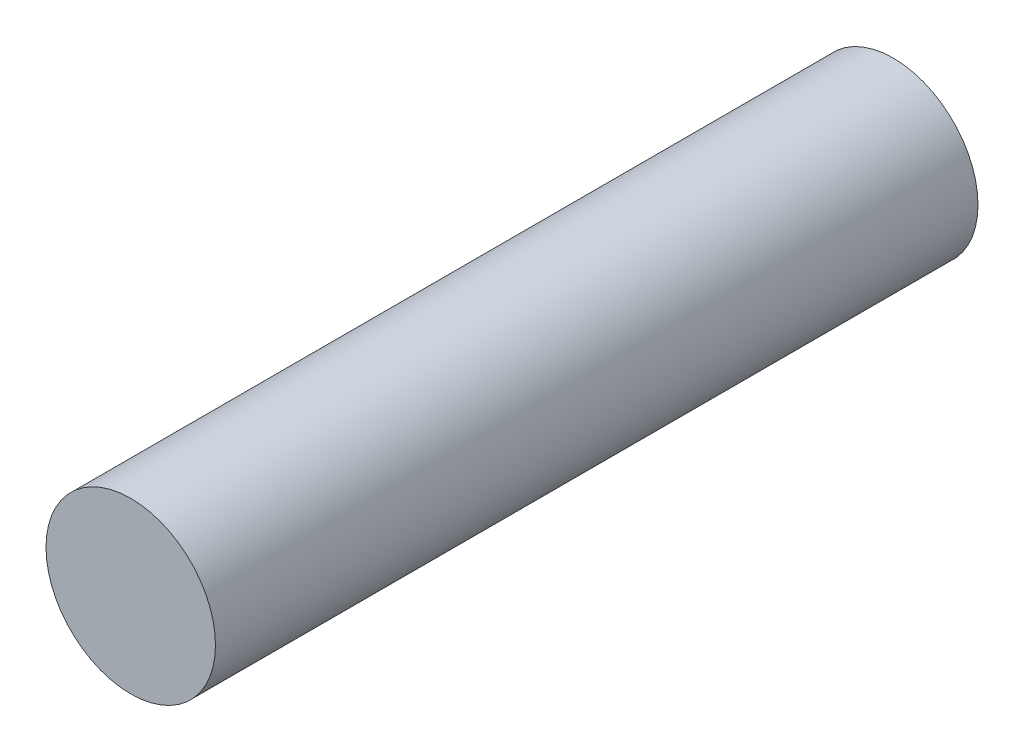
ISO-10303-21;
HEADER;
FILE_DESCRIPTION(('STEP AP214'),'2;1');
FILE_NAME('part.step','',(''),(''),'','','');
FILE_SCHEMA(('AUTOMOTIVE_DESIGN { 1 0 10303 214 1 1 1 1 }'));
ENDSEC;
DATA;
#1=APPLICATION_CONTEXT('core data for automotive mechanical design processes');
#2=APPLICATION_PROTOCOL_DEFINITION('international standard','automotive_design',2000,#1);
#3=PRODUCT_CONTEXT('',#1,'mechanical');
#4=PRODUCT('Part','Part','',(#3));
#5=PRODUCT_RELATED_PRODUCT_CATEGORY('part','',(#4));
#6=PRODUCT_DEFINITION_FORMATION('','',#4);
#7=PRODUCT_DEFINITION_CONTEXT('part definition',#1,'design');
#8=PRODUCT_DEFINITION('design','',#6,#7);
#9=PRODUCT_DEFINITION_SHAPE('','',#8);
#10=(LENGTH_UNIT() NAMED_UNIT(*) SI_UNIT(.MILLI.,.METRE.));
#11=(NAMED_UNIT(*) PLANE_ANGLE_UNIT() SI_UNIT($,.RADIAN.));
#12=(NAMED_UNIT(*) SI_UNIT($,.STERADIAN.) SOLID_ANGLE_UNIT());
#13=UNCERTAINTY_MEASURE_WITH_UNIT(LENGTH_MEASURE(1.E-05),#10,'distance_accuracy_value','');
#14=(GEOMETRIC_REPRESENTATION_CONTEXT(3) GLOBAL_UNCERTAINTY_ASSIGNED_CONTEXT((#13)) GLOBAL_UNIT_ASSIGNED_CONTEXT((#10,
#11,#12)) REPRESENTATION_CONTEXT('',''));
#15=CARTESIAN_POINT('',(0.,0.,0.));
#16=DIRECTION('',(0.,0.,1.));
#17=DIRECTION('',(1.,0.,0.));
#18=AXIS2_PLACEMENT_3D('',#15,#16,#17);
#19=CARTESIAN_POINT('',(0.499999,0.,0.));
#20=DIRECTION('',(0.,0.,-1.));
#21=DIRECTION('',(-1.,0.,0.));
#22=AXIS2_PLACEMENT_3D('',#19,#20,#21);
#23=PLANE('',#22);
#24=CARTESIAN_POINT('',(0.,0.,0.));
#25=DIRECTION('',(0.,0.,-1.));
#26=DIRECTION('',(-1.,0.,0.));
#27=AXIS2_PLACEMENT_3D('',#24,#25,#26);
#28=CIRCLE('',#27,0.499999);
#29=CARTESIAN_POINT('',(-0.499999,0.,0.));
#30=VERTEX_POINT('',#29);
#31=EDGE_CURVE('E18',#30,#30,#28,.F.);
#32=ORIENTED_EDGE('',*,*,#31,.F.);
#33=EDGE_LOOP('',(#32));
#34=FACE_BOUND('',#33,.T.);
#35=ADVANCED_FACE('F15',(#34),#23,.T.);
#36=CARTESIAN_POINT('',(0.499999,0.,4.50000116));
#37=DIRECTION('',(0.,0.,-1.));
#38=DIRECTION('',(-1.,0.,0.));
#39=AXIS2_PLACEMENT_3D('',#36,#37,#38);
#40=PLANE('',#39);
#41=CARTESIAN_POINT('',(0.,0.,4.50000116));
#42=DIRECTION('',(0.,0.,-1.));
#43=DIRECTION('',(-1.,0.,0.));
#44=AXIS2_PLACEMENT_3D('',#41,#42,#43);
#45=CIRCLE('',#44,0.499999);
#46=CARTESIAN_POINT('',(-0.499999,0.,4.50000116));
#47=VERTEX_POINT('',#46);
#48=EDGE_CURVE('E10',#47,#47,#45,.T.);
#49=ORIENTED_EDGE('',*,*,#48,.F.);
#50=EDGE_LOOP('',(#49));
#51=FACE_BOUND('',#50,.T.);
#52=ADVANCED_FACE('F30',(#51),#40,.F.);
#53=CARTESIAN_POINT('',(0.,0.,0.));
#54=DIRECTION('',(0.,0.,-1.));
#55=DIRECTION('',(-1.,0.,0.));
#56=AXIS2_PLACEMENT_3D('',#53,#54,#55);
#57=CYLINDRICAL_SURFACE('',#56,0.499999);
#58=ORIENTED_EDGE('',*,*,#48,.T.);
#59=EDGE_LOOP('',(#58));
#60=FACE_BOUND('',#59,.T.);
#61=ORIENTED_EDGE('',*,*,#31,.T.);
#62=EDGE_LOOP('',(#61));
#63=FACE_BOUND('',#62,.T.);
#64=ADVANCED_FACE('F27',(#60,#63),#57,.T.);
#65=CLOSED_SHELL('',(#35,#52,#64));
#66=MANIFOLD_SOLID_BREP('B1',#65);
#67=ADVANCED_BREP_SHAPE_REPRESENTATION('',(#18,#66),#14);
#68=SHAPE_DEFINITION_REPRESENTATION(#9,#67);
ENDSEC;
END-ISO-10303-21;
